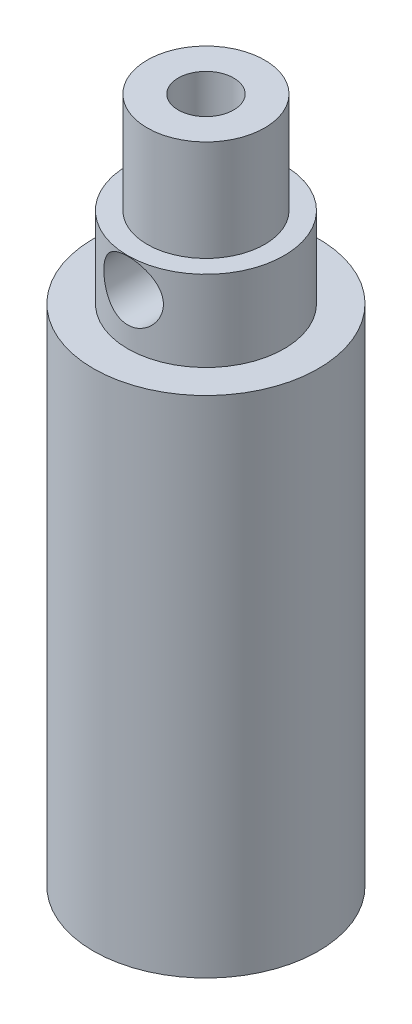
ISO-10303-21;
HEADER;
FILE_DESCRIPTION(('STEP AP214'),'2;1');
FILE_NAME('part.step','',(''),(''),'','','');
FILE_SCHEMA(('AUTOMOTIVE_DESIGN { 1 0 10303 214 1 1 1 1 }'));
ENDSEC;
DATA;
#1=APPLICATION_CONTEXT('core data for automotive mechanical design processes');
#2=APPLICATION_PROTOCOL_DEFINITION('international standard','automotive_design',2000,#1);
#3=PRODUCT_CONTEXT('',#1,'mechanical');
#4=PRODUCT('Part','Part','',(#3));
#5=PRODUCT_RELATED_PRODUCT_CATEGORY('part','',(#4));
#6=PRODUCT_DEFINITION_FORMATION('','',#4);
#7=PRODUCT_DEFINITION_CONTEXT('part definition',#1,'design');
#8=PRODUCT_DEFINITION('design','',#6,#7);
#9=PRODUCT_DEFINITION_SHAPE('','',#8);
#10=(LENGTH_UNIT() NAMED_UNIT(*) SI_UNIT(.MILLI.,.METRE.));
#11=(NAMED_UNIT(*) PLANE_ANGLE_UNIT() SI_UNIT($,.RADIAN.));
#12=(NAMED_UNIT(*) SI_UNIT($,.STERADIAN.) SOLID_ANGLE_UNIT());
#13=UNCERTAINTY_MEASURE_WITH_UNIT(LENGTH_MEASURE(1.E-05),#10,'distance_accuracy_value','');
#14=(GEOMETRIC_REPRESENTATION_CONTEXT(3) GLOBAL_UNCERTAINTY_ASSIGNED_CONTEXT((#13)) GLOBAL_UNIT_ASSIGNED_CONTEXT((#10,
#11,#12)) REPRESENTATION_CONTEXT('',''));
#15=CARTESIAN_POINT('',(0.,0.,0.));
#16=DIRECTION('',(0.,0.,1.));
#17=DIRECTION('',(1.,0.,0.));
#18=AXIS2_PLACEMENT_3D('',#15,#16,#17);
#19=CARTESIAN_POINT('',(0.,0.,0.));
#20=DIRECTION('',(0.,1.,0.));
#21=DIRECTION('',(0.,0.,1.));
#22=AXIS2_PLACEMENT_3D('',#19,#20,#21);
#23=CYLINDRICAL_SURFACE('',#22,2.75);
#24=CARTESIAN_POINT('',(0.,35.,0.));
#25=DIRECTION('',(0.,1.,0.));
#26=DIRECTION('',(0.,0.,1.));
#27=AXIS2_PLACEMENT_3D('',#24,#25,#26);
#28=CIRCLE('',#27,2.75);
#29=CARTESIAN_POINT('',(0.,35.,2.75));
#30=VERTEX_POINT('',#29);
#31=EDGE_CURVE('E144',#30,#30,#28,.T.);
#32=ORIENTED_EDGE('',*,*,#31,.F.);
#33=EDGE_LOOP('',(#32));
#34=FACE_BOUND('',#33,.T.);
#35=CARTESIAN_POINT('',(0.,68.,0.));
#36=DIRECTION('',(0.,1.,0.));
#37=DIRECTION('',(0.,0.,1.));
#38=AXIS2_PLACEMENT_3D('',#35,#36,#37);
#39=CIRCLE('',#38,2.75);
#40=CARTESIAN_POINT('',(0.,68.,2.75));
#41=VERTEX_POINT('',#40);
#42=EDGE_CURVE('E112',#41,#41,#39,.T.);
#43=ORIENTED_EDGE('',*,*,#42,.T.);
#44=EDGE_LOOP('',(#43));
#45=FACE_BOUND('',#44,.T.);
#46=DIRECTION('',(0.,1.,0.));
#47=VECTOR('',#46,1.);
#48=CARTESIAN_POINT('',(2.47785123976966,0.,1.1927922004993));
#49=LINE('',#48,#47);
#50=CARTESIAN_POINT('',(2.47785123976966,56.6008601542833,1.1927922004993));
#51=VERTEX_POINT('',#50);
#52=CARTESIAN_POINT('',(2.47785123976966,53.3991398457167,1.1927922004993));
#53=VERTEX_POINT('',#52);
#54=EDGE_CURVE('E12',#51,#53,#49,.F.);
#55=ORIENTED_EDGE('',*,*,#54,.F.);
#56=CARTESIAN_POINT('',(2.47785123976966,56.6008601542833,1.1927922004993));
#57=CARTESIAN_POINT('',(2.45691590086338,56.6332698766965,1.23626974499691));
#58=CARTESIAN_POINT('',(2.43492000277298,56.6659151317765,1.27904768779553));
#59=CARTESIAN_POINT('',(2.38878723279597,56.7314144832793,1.36327108741837));
#60=CARTESIAN_POINT('',(2.36465030139766,56.7642685854837,1.40471650716041));
#61=CARTESIAN_POINT('',(2.28889609665299,56.862883337748,1.52731866762622));
#62=CARTESIAN_POINT('',(2.23402150569533,56.9285607110212,1.60656267759827));
#63=CARTESIAN_POINT('',(2.11471529700325,57.0587302746027,1.76070466170261));
#64=CARTESIAN_POINT('',(2.05018119807848,57.1232002038607,1.83554230088267));
#65=CARTESIAN_POINT('',(1.91183806923222,57.2485732728751,1.97921894225549));
#66=CARTESIAN_POINT('',(1.83803945274993,57.3094803064205,2.04806453472508));
#67=CARTESIAN_POINT('',(1.66035590525942,57.441507112717,2.19598322277191));
#68=CARTESIAN_POINT('',(1.55364402224241,57.5111476122604,2.27304092924748));
#69=CARTESIAN_POINT('',(1.325576185214,57.638618556714,2.41311865633127));
#70=CARTESIAN_POINT('',(1.20428556415607,57.6964987783296,2.4761979495782));
#71=CARTESIAN_POINT('',(0.969492333384041,57.7885000079789,2.57605154297455));
#72=CARTESIAN_POINT('',(0.858041808235639,57.824970462666,2.61545468937514));
#73=CARTESIAN_POINT('',(0.627656214154241,57.8849070662636,2.68008129760087));
#74=CARTESIAN_POINT('',(0.508721290025062,57.9083734666829,2.70530503366729));
#75=CARTESIAN_POINT('',(0.265971255416853,57.9405453792016,2.7398627021727));
#76=CARTESIAN_POINT('',(0.142135767246276,57.9491807254557,2.74912110330246));
#77=CARTESIAN_POINT('',(-0.105726407274162,57.9507069313105,2.75075838286497));
#78=CARTESIAN_POINT('',(-0.22975304036205,57.9436015842491,2.74314132810105));
#79=CARTESIAN_POINT('',(-0.463869389757413,57.9154924981933,2.71295470049847));
#80=CARTESIAN_POINT('',(-0.574271934458768,57.8956667854339,2.69165232141047));
#81=CARTESIAN_POINT('',(-0.789153088246138,57.8446356645568,2.63667501622997));
#82=CARTESIAN_POINT('',(-0.89363012192504,57.8134272463718,2.6029968174312));
#83=CARTESIAN_POINT('',(-1.12685191523176,57.729928244538,2.51254970744046));
#84=CARTESIAN_POINT('',(-1.25280115757686,57.6740910406292,2.45184576238044));
#85=CARTESIAN_POINT('',(-1.48963550997847,57.5498003786474,2.31565268992034));
#86=CARTESIAN_POINT('',(-1.60048548884415,57.4813183428441,2.24013004705675));
#87=CARTESIAN_POINT('',(-1.84170194635459,57.3106702783203,2.0497818062155));
#88=CARTESIAN_POINT('',(-1.96591948066676,57.2049613767916,1.93031722697554));
#89=CARTESIAN_POINT('',(-2.13184280399656,57.040548126634,1.73921379222929));
#90=CARTESIAN_POINT('',(-2.18376218392696,56.9847516867598,1.67350742417047));
#91=CARTESIAN_POINT('',(-2.28105113522916,56.8721177755293,1.53825876150248));
#92=CARTESIAN_POINT('',(-2.32642418538799,56.8152808753156,1.46871853160547));
#93=CARTESIAN_POINT('',(-2.38819570426837,56.7320817679832,1.36400579606804));
#94=CARTESIAN_POINT('',(-2.40711819654542,56.7056689766892,1.3303312236134));
#95=CARTESIAN_POINT('',(-2.44353699137948,56.6530724913947,1.26218575222079));
#96=CARTESIAN_POINT('',(-2.46103636671074,56.6268884189801,1.22771678701234));
#97=CARTESIAN_POINT('',(-2.47785123976966,56.6008601542833,1.1927922004993));
#98=B_SPLINE_CURVE_WITH_KNOTS('',3,(#56,#57,#58,#59,#60,#61,#62,#63,#64,#65,#66,#67,#68,#69,#70,
#71,#72,#73,#74,#75,#76,#77,#78,#79,#80,#81,#82,#83,#84,#85,#86,#87,#88,#89,#90,#91,#92,#93,#94,
#95,#96,#97),.UNSPECIFIED.,.F.,.F.,(4,2,2,2,2,2,2,2,2,2,2,2,2,2,2,2,2,2,2,2,4),(0.,
0.174353919779955,0.348712687384918,0.698148696355609,1.05159616615623,1.40464985496544,
1.84978099103621,2.2929868996592,2.66258502259707,3.03217599696174,3.40351074158639,
3.77475600826656,4.11579134524117,4.45691693180207,4.9060946982763,5.3563003304899,
5.95933623611324,6.26102932442716,6.56256149471044,6.702920826426,6.84296857185743),.UNSPECIFIED.);
#99=CARTESIAN_POINT('',(-2.47785123976966,56.6008601542833,1.1927922004993));
#100=VERTEX_POINT('',#99);
#101=EDGE_CURVE('E53',#51,#100,#98,.T.);
#102=ORIENTED_EDGE('',*,*,#101,.T.);
#103=DIRECTION('',(0.,1.,0.));
#104=VECTOR('',#103,1.);
#105=CARTESIAN_POINT('',(-2.47785123976966,0.,1.1927922004993));
#106=LINE('',#105,#104);
#107=CARTESIAN_POINT('',(-2.47785123976966,53.3991398457167,1.1927922004993));
#108=VERTEX_POINT('',#107);
#109=EDGE_CURVE('E81',#108,#100,#106,.T.);
#110=ORIENTED_EDGE('',*,*,#109,.F.);
#111=CARTESIAN_POINT('',(-2.47785123976966,53.3991398457167,1.1927922004993));
#112=CARTESIAN_POINT('',(-2.45691590086338,53.3667301233036,1.23626974499691));
#113=CARTESIAN_POINT('',(-2.43492000277297,53.3340848682235,1.27904768779553));
#114=CARTESIAN_POINT('',(-2.38878723279597,53.2685855167207,1.36327108741837));
#115=CARTESIAN_POINT('',(-2.36465030139765,53.2357314145163,1.40471650716042));
#116=CARTESIAN_POINT('',(-2.28889609665299,53.137116662252,1.52731866762622));
#117=CARTESIAN_POINT('',(-2.23402150569533,53.0714392889788,1.60656267759827));
#118=CARTESIAN_POINT('',(-2.11471529700325,52.9412697253973,1.76070466170261));
#119=CARTESIAN_POINT('',(-2.05018119807848,52.8767997961393,1.83554230088267));
#120=CARTESIAN_POINT('',(-1.91183806923222,52.7514267271249,1.9792189422555));
#121=CARTESIAN_POINT('',(-1.83803945274993,52.6905196935795,2.04806453472508));
#122=CARTESIAN_POINT('',(-1.66035590525942,52.558492887283,2.19598322277191));
#123=CARTESIAN_POINT('',(-1.55364402224241,52.4888523877396,2.27304092924748));
#124=CARTESIAN_POINT('',(-1.325576185214,52.3613814432861,2.41311865633127));
#125=CARTESIAN_POINT('',(-1.20428556415607,52.3035012216704,2.4761979495782));
#126=CARTESIAN_POINT('',(-0.96949233338404,52.2114999920211,2.57605154297455));
#127=CARTESIAN_POINT('',(-0.858041808235638,52.175029537334,2.61545468937514));
#128=CARTESIAN_POINT('',(-0.627656214154241,52.1150929337364,2.68008129760087));
#129=CARTESIAN_POINT('',(-0.508721290025061,52.0916265333171,2.70530503366729));
#130=CARTESIAN_POINT('',(-0.265971255416851,52.0594546207984,2.7398627021727));
#131=CARTESIAN_POINT('',(-0.142135767246275,52.0508192745443,2.74912110330246));
#132=CARTESIAN_POINT('',(0.105726407274164,52.0492930686895,2.75075838286497));
#133=CARTESIAN_POINT('',(0.229753040362051,52.056398415751,2.74314132810105));
#134=CARTESIAN_POINT('',(0.463869389757415,52.0845075018067,2.71295470049847));
#135=CARTESIAN_POINT('',(0.574271934458772,52.1043332145661,2.69165232141047));
#136=CARTESIAN_POINT('',(0.789153088246142,52.1553643354433,2.63667501622997));
#137=CARTESIAN_POINT('',(0.893630121925043,52.1865727536282,2.6029968174312));
#138=CARTESIAN_POINT('',(1.12685191523176,52.270071755462,2.51254970744046));
#139=CARTESIAN_POINT('',(1.25280115757686,52.3259089593708,2.45184576238044));
#140=CARTESIAN_POINT('',(1.48963550997847,52.4501996213526,2.31565268992034));
#141=CARTESIAN_POINT('',(1.60048548884415,52.518681657156,2.24013004705675));
#142=CARTESIAN_POINT('',(1.8417019463546,52.6893297216797,2.0497818062155));
#143=CARTESIAN_POINT('',(1.96591948066676,52.7950386232084,1.93031722697554));
#144=CARTESIAN_POINT('',(2.13184280399656,52.9594518733661,1.73921379222929));
#145=CARTESIAN_POINT('',(2.18376218392696,53.0152483132402,1.67350742417047));
#146=CARTESIAN_POINT('',(2.28105113522916,53.1278822244707,1.53825876150249));
#147=CARTESIAN_POINT('',(2.32642418538799,53.1847191246844,1.46871853160547));
#148=CARTESIAN_POINT('',(2.38819570426837,53.2679182320168,1.36400579606804));
#149=CARTESIAN_POINT('',(2.40711819654543,53.2943310233108,1.33033122361339));
#150=CARTESIAN_POINT('',(2.44353699137948,53.3469275086053,1.26218575222079));
#151=CARTESIAN_POINT('',(2.46103636671074,53.3731115810199,1.22771678701234));
#152=CARTESIAN_POINT('',(2.47785123976966,53.3991398457167,1.1927922004993));
#153=B_SPLINE_CURVE_WITH_KNOTS('',3,(#111,#112,#113,#114,#115,#116,#117,#118,#119,#120,#121,
#122,#123,#124,#125,#126,#127,#128,#129,#130,#131,#132,#133,#134,#135,#136,#137,#138,#139,#140,
#141,#142,#143,#144,#145,#146,#147,#148,#149,#150,#151,#152),.UNSPECIFIED.,.F.,.F.,(4,2,2,2,2,2,
2,2,2,2,2,2,2,2,2,2,2,2,2,2,4),(0.,0.174353919779958,0.34871268738492,0.698148696355608,
1.05159616615623,1.40464985496544,1.84978099103622,2.2929868996592,2.66258502259707,
3.03217599696174,3.40351074158639,3.77475600826656,4.11579134524118,4.45691693180207,
4.9060946982763,5.3563003304899,5.95933623611324,6.26102932442716,6.56256149471044,
6.70292082642601,6.84296857185743),.UNSPECIFIED.);
#154=EDGE_CURVE('E78',#108,#53,#153,.T.);
#155=ORIENTED_EDGE('',*,*,#154,.T.);
#156=EDGE_LOOP('',(#55,#102,#110,#155));
#157=FACE_BOUND('',#156,.T.);
#158=ADVANCED_FACE('F45',(#34,#45,#157),#23,.F.);
#159=CARTESIAN_POINT('',(0.,50.,0.));
#160=DIRECTION('',(0.,-1.,0.));
#161=DIRECTION('',(0.,0.,-1.));
#162=AXIS2_PLACEMENT_3D('',#159,#160,#161);
#163=CYLINDRICAL_SURFACE('',#162,11.15);
#164=CARTESIAN_POINT('',(0.,50.,0.));
#165=DIRECTION('',(0.,1.,0.));
#166=DIRECTION('',(0.,0.,1.));
#167=AXIS2_PLACEMENT_3D('',#164,#165,#166);
#168=CIRCLE('',#167,11.15);
#169=CARTESIAN_POINT('',(0.,50.,11.15));
#170=VERTEX_POINT('',#169);
#171=EDGE_CURVE('E156',#170,#170,#168,.T.);
#172=ORIENTED_EDGE('',*,*,#171,.F.);
#173=EDGE_LOOP('',(#172));
#174=FACE_BOUND('',#173,.T.);
#175=CARTESIAN_POINT('',(0.,0.,0.));
#176=DIRECTION('',(0.,1.,0.));
#177=DIRECTION('',(0.,0.,1.));
#178=AXIS2_PLACEMENT_3D('',#175,#176,#177);
#179=CIRCLE('',#178,11.15);
#180=CARTESIAN_POINT('',(0.,0.,11.15));
#181=VERTEX_POINT('',#180);
#182=EDGE_CURVE('E153',#181,#181,#179,.T.);
#183=ORIENTED_EDGE('',*,*,#182,.T.);
#184=EDGE_LOOP('',(#183));
#185=FACE_BOUND('',#184,.T.);
#186=ADVANCED_FACE('F47',(#174,#185),#163,.T.);
#187=CARTESIAN_POINT('',(0.,50.,0.));
#188=DIRECTION('',(0.,1.,0.));
#189=DIRECTION('',(0.,0.,1.));
#190=AXIS2_PLACEMENT_3D('',#187,#188,#189);
#191=PLANE('',#190);
#192=CARTESIAN_POINT('',(0.,50.,0.));
#193=DIRECTION('',(0.,1.,0.));
#194=DIRECTION('',(0.,0.,1.));
#195=AXIS2_PLACEMENT_3D('',#192,#193,#194);
#196=CIRCLE('',#195,7.75);
#197=CARTESIAN_POINT('',(0.,50.,7.75));
#198=VERTEX_POINT('',#197);
#199=EDGE_CURVE('E160',#198,#198,#196,.T.);
#200=ORIENTED_EDGE('',*,*,#199,.F.);
#201=EDGE_LOOP('',(#200));
#202=FACE_BOUND('',#201,.T.);
#203=ORIENTED_EDGE('',*,*,#171,.T.);
#204=EDGE_LOOP('',(#203));
#205=FACE_BOUND('',#204,.T.);
#206=ADVANCED_FACE('F123',(#202,#205),#191,.T.);
#207=CARTESIAN_POINT('',(0.,0.,0.));
#208=DIRECTION('',(0.,1.,0.));
#209=DIRECTION('',(0.,0.,1.));
#210=AXIS2_PLACEMENT_3D('',#207,#208,#209);
#211=PLANE('',#210);
#212=CARTESIAN_POINT('',(0.,0.,0.));
#213=DIRECTION('',(0.,-1.,0.));
#214=DIRECTION('',(0.,0.,-1.));
#215=AXIS2_PLACEMENT_3D('',#212,#213,#214);
#216=CIRCLE('',#215,9.1);
#217=CARTESIAN_POINT('',(0.,0.,-9.1));
#218=VERTEX_POINT('',#217);
#219=EDGE_CURVE('E148',#218,#218,#216,.T.);
#220=ORIENTED_EDGE('',*,*,#219,.F.);
#221=EDGE_LOOP('',(#220));
#222=FACE_BOUND('',#221,.T.);
#223=ORIENTED_EDGE('',*,*,#182,.F.);
#224=EDGE_LOOP('',(#223));
#225=FACE_BOUND('',#224,.T.);
#226=ADVANCED_FACE('F120',(#222,#225),#211,.F.);
#227=CARTESIAN_POINT('',(0.,58.,0.));
#228=DIRECTION('',(0.,-1.,0.));
#229=DIRECTION('',(0.,0.,-1.));
#230=AXIS2_PLACEMENT_3D('',#227,#228,#229);
#231=CYLINDRICAL_SURFACE('',#230,7.75);
#232=CARTESIAN_POINT('',(2.95,55.,7.16658914686757));
#233=CARTESIAN_POINT('',(2.94998865866583,54.8409948195034,7.16659961457185));
#234=CARTESIAN_POINT('',(2.93707897730719,54.6818423559038,7.17195027676966));
#235=CARTESIAN_POINT('',(2.88598302030448,54.3684477059428,7.19265723532857));
#236=CARTESIAN_POINT('',(2.847798089523,54.2142052587835,7.20801299933077));
#237=CARTESIAN_POINT('',(2.74778636632212,53.9151171211151,7.24672444996012));
#238=CARTESIAN_POINT('',(2.6860177699288,53.7702493183433,7.27006042960501));
#239=CARTESIAN_POINT('',(2.54079343858982,53.4928830185756,7.32207596587927));
#240=CARTESIAN_POINT('',(2.4573309842523,53.3603883713184,7.35075717734474));
#241=CARTESIAN_POINT('',(2.26650919340754,53.1047302468616,7.4118764900262));
#242=CARTESIAN_POINT('',(2.15821743051809,52.9822894236851,7.44442738440248));
#243=CARTESIAN_POINT('',(1.92278736870598,52.7567952014205,7.50867931031878));
#244=CARTESIAN_POINT('',(1.7956449022786,52.6537461009062,7.54038015209485));
#245=CARTESIAN_POINT('',(1.52060740550182,52.4664483038574,7.60070607373645));
#246=CARTESIAN_POINT('',(1.37213929386288,52.3829893409258,7.62918355165808));
#247=CARTESIAN_POINT('',(1.0619938848085,52.2425343414784,7.67849412038476));
#248=CARTESIAN_POINT('',(0.900321343029722,52.1855288266238,7.69932994865072));
#249=CARTESIAN_POINT('',(0.575957656989306,52.1021460843827,7.73020844490016));
#250=CARTESIAN_POINT('',(0.413629060097805,52.0745236590281,7.7406884428877));
#251=CARTESIAN_POINT('',(0.0863246789741779,52.0466970227121,7.75124643567573));
#252=CARTESIAN_POINT('',(-0.078650199815708,52.0464836256015,7.7513279155446));
#253=CARTESIAN_POINT('',(-0.397622394883306,52.0727653702648,7.74135519764024));
#254=CARTESIAN_POINT('',(-0.551750759182599,52.0979002655375,7.73181720128206));
#255=CARTESIAN_POINT('',(-0.85341198876398,52.1718713225362,7.70435841497361));
#256=CARTESIAN_POINT('',(-1.00094438469224,52.220709167987,7.6864370295176));
#257=CARTESIAN_POINT('',(-1.28780328759038,52.3413096338999,7.64365231004129));
#258=CARTESIAN_POINT('',(-1.42697737562484,52.4133985445684,7.61869084697264));
#259=CARTESIAN_POINT('',(-1.69160226459349,52.5781624731188,7.56434116402282));
#260=CARTESIAN_POINT('',(-1.81704854756465,52.6708442380929,7.53495149429155));
#261=CARTESIAN_POINT('',(-2.0586541808929,52.8806711812751,7.47267931034266));
#262=CARTESIAN_POINT('',(-2.17380205030234,52.998951965117,7.43969303231914));
#263=CARTESIAN_POINT('',(-2.38301642959986,53.253328015287,7.37534680425408));
#264=CARTESIAN_POINT('',(-2.4770773093192,53.3894280239717,7.34398729026782));
#265=CARTESIAN_POINT('',(-2.64346222795297,53.679686588324,7.28577963612884));
#266=CARTESIAN_POINT('',(-2.7152242086891,53.8341940452033,7.25905467077139));
#267=CARTESIAN_POINT('',(-2.83132365974512,54.1543868572594,7.21456984720107));
#268=CARTESIAN_POINT('',(-2.87567694880983,54.3200657035844,7.1968048189104));
#269=CARTESIAN_POINT('',(-2.9333639759074,54.6478796156304,7.17347861436356));
#270=CARTESIAN_POINT('',(-2.94830942981538,54.809685609154,7.16728435721403));
#271=CARTESIAN_POINT('',(-2.95141775355474,55.1335766601199,7.166006233469));
#272=CARTESIAN_POINT('',(-2.93958761316205,55.2956616336968,7.17091946725967));
#273=CARTESIAN_POINT('',(-2.89094334864833,55.6070953807451,7.19065823635581));
#274=CARTESIAN_POINT('',(-2.85539489277321,55.7566774506741,7.20498108432288));
#275=CARTESIAN_POINT('',(-2.76192641295152,56.0476787650716,7.24132298865376));
#276=CARTESIAN_POINT('',(-2.70400172164676,56.189096299458,7.26334365057875));
#277=CARTESIAN_POINT('',(-2.5649387586666,56.4657672272932,7.31363382023783));
#278=CARTESIAN_POINT('',(-2.48299806738495,56.6005786196518,7.34210994586741));
#279=CARTESIAN_POINT('',(-2.29907525984968,56.8551086789892,7.40176249942683));
#280=CARTESIAN_POINT('',(-2.19708561837067,56.9748216511057,7.43293993880996));
#281=CARTESIAN_POINT('',(-1.96803871575943,57.2039154699733,7.49695600968506));
#282=CARTESIAN_POINT('',(-1.83977509700773,57.312101532753,7.5297692769403));
#283=CARTESIAN_POINT('',(-1.5661127510559,57.5055667794596,7.59140554401753));
#284=CARTESIAN_POINT('',(-1.42071384014262,57.5908457177594,7.62022850105089));
#285=CARTESIAN_POINT('',(-1.11687903714305,57.7355623306532,7.6706387975175));
#286=CARTESIAN_POINT('',(-0.958481193978615,57.7950724343335,7.69224637769313));
#287=CARTESIAN_POINT('',(-0.6329094401338,57.8862545128972,7.72584286550078));
#288=CARTESIAN_POINT('',(-0.465739836862944,57.9179400180737,7.73783644789268));
#289=CARTESIAN_POINT('',(-0.138152667403949,57.9510816562428,7.75039822169678));
#290=CARTESIAN_POINT('',(0.0220702639674789,57.9542333972392,7.75160721547871));
#291=CARTESIAN_POINT('',(0.340668610032347,57.9346052413507,7.74414770360241));
#292=CARTESIAN_POINT('',(0.499044256541421,57.9118286343639,7.73548045108384));
#293=CARTESIAN_POINT('',(0.805302514211144,57.8421869538426,7.70954120088729));
#294=CARTESIAN_POINT('',(0.953350287215577,57.7959570352139,7.69249644155938));
#295=CARTESIAN_POINT('',(1.23959174775678,57.6813603041514,7.6515905381698));
#296=CARTESIAN_POINT('',(1.37778356281402,57.6129892988518,7.62772810314318));
#297=CARTESIAN_POINT('',(1.64684167138755,57.452747099893,7.57430057445326));
#298=CARTESIAN_POINT('',(1.77714523020146,57.3599989839134,7.54453587470056));
#299=CARTESIAN_POINT('',(2.02085884092083,57.1549943808291,7.4829444562399));
#300=CARTESIAN_POINT('',(2.13426276505881,57.0427308492927,7.45111699555301));
#301=CARTESIAN_POINT('',(2.34735102621369,56.7946139064405,7.38684695548433));
#302=CARTESIAN_POINT('',(2.44594381918208,56.6578052668254,7.35446615381571));
#303=CARTESIAN_POINT('',(2.61882677858092,56.3684298156329,7.29470101785897));
#304=CARTESIAN_POINT('',(2.69311297869883,56.2158604375812,7.26731749934194));
#305=CARTESIAN_POINT('',(2.7860474187925,55.9739157583894,7.23198490629082));
#306=CARTESIAN_POINT('',(2.81442401232459,55.888607585256,7.22095584260402));
#307=CARTESIAN_POINT('',(2.86333202022289,55.715476716251,7.2017029426031));
#308=CARTESIAN_POINT('',(2.88386700812949,55.6276551854163,7.19347782866967));
#309=CARTESIAN_POINT('',(2.91682438897929,55.4502962594891,7.180177910666));
#310=CARTESIAN_POINT('',(2.92924964998094,55.3607594825486,7.17510199289316));
#311=CARTESIAN_POINT('',(2.94584012036048,55.1808309412681,7.16830486171353));
#312=CARTESIAN_POINT('',(2.95000645074745,55.0904392946359,7.16658319302513));
#313=CARTESIAN_POINT('',(2.95,55.,7.16658914686757));
#314=B_SPLINE_CURVE_WITH_KNOTS('',3,(#232,#233,#234,#235,#236,#237,#238,#239,#240,#241,#242,
#243,#244,#245,#246,#247,#248,#249,#250,#251,#252,#253,#254,#255,#256,#257,#258,#259,#260,#261,
#262,#263,#264,#265,#266,#267,#268,#269,#270,#271,#272,#273,#274,#275,#276,#277,#278,#279,#280,
#281,#282,#283,#284,#285,#286,#287,#288,#289,#290,#291,#292,#293,#294,#295,#296,#297,#298,#299,
#300,#301,#302,#303,#304,#305,#306,#307,#308,#309,#310,#311,#312,#313),.UNSPECIFIED.,.T.,.F.,(4,
2,2,2,2,2,2,2,2,2,2,2,2,2,2,2,2,2,2,2,2,2,2,2,2,2,2,2,2,2,2,2,2,2,2,2,2,2,2,2,4),(0.,
0.476673970950883,0.953322580748914,1.42880251612635,1.90442990112557,2.40222374729265,
2.90012781004585,3.4155633970953,3.93081415937344,4.42323452670125,4.9154898586714,
5.38266477404106,5.84987287975773,6.32394567001607,6.79817401627103,7.30090782753367,
7.80377570791233,8.31844747311426,8.83282192081794,9.31812040609934,9.80329221869572,
10.2644485042275,10.7257010322565,11.2045779945129,11.683635044085,12.1941518666764,
12.7046741631856,13.2137520580535,13.7225822658483,14.2009613286324,14.6792796994279,
15.1452856405035,15.6113798809539,16.0973268686629,16.5834496330895,17.0961961978996,
17.6090263902292,17.8804066066901,18.1516630029985,18.4228234156361,18.693947020348),.UNSPECIFIED.);
#315=CARTESIAN_POINT('',(2.95,55.,7.16658914686757));
#316=VERTEX_POINT('',#315);
#317=EDGE_CURVE('E105',#316,#316,#314,.T.);
#318=ORIENTED_EDGE('',*,*,#317,.T.);
#319=EDGE_LOOP('',(#318));
#320=FACE_BOUND('',#319,.T.);
#321=CARTESIAN_POINT('',(0.,58.,0.));
#322=DIRECTION('',(0.,1.,0.));
#323=DIRECTION('',(0.,0.,1.));
#324=AXIS2_PLACEMENT_3D('',#321,#322,#323);
#325=CIRCLE('',#324,7.75);
#326=CARTESIAN_POINT('',(0.,58.,7.75));
#327=VERTEX_POINT('',#326);
#328=EDGE_CURVE('E157',#327,#327,#325,.T.);
#329=ORIENTED_EDGE('',*,*,#328,.F.);
#330=EDGE_LOOP('',(#329));
#331=FACE_BOUND('',#330,.T.);
#332=ORIENTED_EDGE('',*,*,#199,.T.);
#333=EDGE_LOOP('',(#332));
#334=FACE_BOUND('',#333,.T.);
#335=ADVANCED_FACE('F114',(#320,#331,#334),#231,.T.);
#336=CARTESIAN_POINT('',(0.,58.,0.));
#337=DIRECTION('',(0.,1.,0.));
#338=DIRECTION('',(0.,0.,1.));
#339=AXIS2_PLACEMENT_3D('',#336,#337,#338);
#340=PLANE('',#339);
#341=CARTESIAN_POINT('',(0.,58.,0.));
#342=DIRECTION('',(0.,1.,0.));
#343=DIRECTION('',(0.,0.,1.));
#344=AXIS2_PLACEMENT_3D('',#341,#342,#343);
#345=CIRCLE('',#344,5.825);
#346=CARTESIAN_POINT('',(0.,58.,5.825));
#347=VERTEX_POINT('',#346);
#348=EDGE_CURVE('E83',#347,#347,#345,.T.);
#349=ORIENTED_EDGE('',*,*,#348,.F.);
#350=EDGE_LOOP('',(#349));
#351=FACE_BOUND('',#350,.T.);
#352=ORIENTED_EDGE('',*,*,#328,.T.);
#353=EDGE_LOOP('',(#352));
#354=FACE_BOUND('',#353,.T.);
#355=ADVANCED_FACE('F119',(#351,#354),#340,.T.);
#356=CARTESIAN_POINT('',(0.,68.,0.));
#357=DIRECTION('',(0.,-1.,0.));
#358=DIRECTION('',(0.,0.,-1.));
#359=AXIS2_PLACEMENT_3D('',#356,#357,#358);
#360=CYLINDRICAL_SURFACE('',#359,5.825);
#361=CARTESIAN_POINT('',(0.,68.,0.));
#362=DIRECTION('',(0.,1.,0.));
#363=DIRECTION('',(0.,0.,1.));
#364=AXIS2_PLACEMENT_3D('',#361,#362,#363);
#365=CIRCLE('',#364,5.825);
#366=CARTESIAN_POINT('',(0.,68.,5.825));
#367=VERTEX_POINT('',#366);
#368=EDGE_CURVE('E165',#367,#367,#365,.T.);
#369=ORIENTED_EDGE('',*,*,#368,.F.);
#370=EDGE_LOOP('',(#369));
#371=FACE_BOUND('',#370,.T.);
#372=ORIENTED_EDGE('',*,*,#348,.T.);
#373=EDGE_LOOP('',(#372));
#374=FACE_BOUND('',#373,.T.);
#375=ADVANCED_FACE('F182',(#371,#374),#360,.T.);
#376=CARTESIAN_POINT('',(0.,68.,0.));
#377=DIRECTION('',(0.,1.,0.));
#378=DIRECTION('',(0.,0.,1.));
#379=AXIS2_PLACEMENT_3D('',#376,#377,#378);
#380=PLANE('',#379);
#381=ORIENTED_EDGE('',*,*,#42,.F.);
#382=EDGE_LOOP('',(#381));
#383=FACE_BOUND('',#382,.T.);
#384=ORIENTED_EDGE('',*,*,#368,.T.);
#385=EDGE_LOOP('',(#384));
#386=FACE_BOUND('',#385,.T.);
#387=ADVANCED_FACE('F179',(#383,#386),#380,.T.);
#388=CARTESIAN_POINT('',(0.,35.,0.));
#389=DIRECTION('',(0.,1.,0.));
#390=DIRECTION('',(0.,0.,1.));
#391=AXIS2_PLACEMENT_3D('',#388,#389,#390);
#392=PLANE('',#391);
#393=ORIENTED_EDGE('',*,*,#31,.T.);
#394=EDGE_LOOP('',(#393));
#395=FACE_BOUND('',#394,.T.);
#396=CARTESIAN_POINT('',(0.,35.,0.));
#397=DIRECTION('',(0.,1.,0.));
#398=DIRECTION('',(0.,0.,1.));
#399=AXIS2_PLACEMENT_3D('',#396,#397,#398);
#400=CIRCLE('',#399,9.1);
#401=CARTESIAN_POINT('',(0.,35.,-9.1));
#402=VERTEX_POINT('',#401);
#403=EDGE_CURVE('E151',#402,#402,#400,.F.);
#404=ORIENTED_EDGE('',*,*,#403,.T.);
#405=EDGE_LOOP('',(#404));
#406=FACE_BOUND('',#405,.T.);
#407=ADVANCED_FACE('F173',(#395,#406),#392,.F.);
#408=CARTESIAN_POINT('',(0.,75.7386868351903,0.));
#409=DIRECTION('',(0.,-1.,0.));
#410=DIRECTION('',(0.,0.,-1.));
#411=AXIS2_PLACEMENT_3D('',#408,#409,#410);
#412=CYLINDRICAL_SURFACE('',#411,9.1);
#413=CARTESIAN_POINT('',(0.,0.,-9.1));
#414=CARTESIAN_POINT('',(0.,0.364583333333349,-9.1));
#415=CARTESIAN_POINT('',(0.,0.729166666666684,-9.1));
#416=CARTESIAN_POINT('',(0.,1.45833333333335,-9.1));
#417=CARTESIAN_POINT('',(0.,1.82291666666668,-9.1));
#418=CARTESIAN_POINT('',(0.,2.55208333333334,-9.1));
#419=CARTESIAN_POINT('',(0.,2.91666666666668,-9.1));
#420=CARTESIAN_POINT('',(0.,3.64583333333335,-9.1));
#421=CARTESIAN_POINT('',(0.,4.01041666666668,-9.1));
#422=CARTESIAN_POINT('',(0.,4.73958333333335,-9.1));
#423=CARTESIAN_POINT('',(0.,5.10416666666668,-9.1));
#424=CARTESIAN_POINT('',(0.,5.83333333333334,-9.1));
#425=CARTESIAN_POINT('',(0.,6.19791666666668,-9.1));
#426=CARTESIAN_POINT('',(0.,6.92708333333335,-9.1));
#427=CARTESIAN_POINT('',(0.,7.29166666666668,-9.1));
#428=CARTESIAN_POINT('',(0.,8.02083333333335,-9.1));
#429=CARTESIAN_POINT('',(0.,8.38541666666668,-9.1));
#430=CARTESIAN_POINT('',(0.,9.11458333333334,-9.1));
#431=CARTESIAN_POINT('',(0.,9.47916666666668,-9.1));
#432=CARTESIAN_POINT('',(0.,10.2083333333333,-9.1));
#433=CARTESIAN_POINT('',(0.,10.5729166666667,-9.1));
#434=CARTESIAN_POINT('',(0.,11.3020833333333,-9.1));
#435=CARTESIAN_POINT('',(0.,11.6666666666667,-9.1));
#436=CARTESIAN_POINT('',(0.,12.3958333333333,-9.1));
#437=CARTESIAN_POINT('',(0.,12.7604166666667,-9.1));
#438=CARTESIAN_POINT('',(0.,13.4895833333333,-9.1));
#439=CARTESIAN_POINT('',(0.,13.8541666666667,-9.1));
#440=CARTESIAN_POINT('',(0.,14.5833333333333,-9.1));
#441=CARTESIAN_POINT('',(0.,14.9479166666667,-9.1));
#442=CARTESIAN_POINT('',(0.,15.6770833333333,-9.1));
#443=CARTESIAN_POINT('',(0.,16.0416666666667,-9.1));
#444=CARTESIAN_POINT('',(0.,16.7708333333333,-9.1));
#445=CARTESIAN_POINT('',(0.,17.1354166666667,-9.1));
#446=CARTESIAN_POINT('',(0.,17.8645833333333,-9.1));
#447=CARTESIAN_POINT('',(0.,18.2291666666667,-9.1));
#448=CARTESIAN_POINT('',(0.,18.9583333333333,-9.1));
#449=CARTESIAN_POINT('',(0.,19.3229166666667,-9.1));
#450=CARTESIAN_POINT('',(0.,20.0520833333333,-9.1));
#451=CARTESIAN_POINT('',(0.,20.4166666666667,-9.1));
#452=CARTESIAN_POINT('',(0.,21.1458333333333,-9.1));
#453=CARTESIAN_POINT('',(0.,21.5104166666667,-9.1));
#454=CARTESIAN_POINT('',(0.,22.2395833333333,-9.1));
#455=CARTESIAN_POINT('',(0.,22.6041666666667,-9.1));
#456=CARTESIAN_POINT('',(0.,23.3333333333333,-9.1));
#457=CARTESIAN_POINT('',(0.,23.6979166666667,-9.1));
#458=CARTESIAN_POINT('',(0.,24.4270833333333,-9.1));
#459=CARTESIAN_POINT('',(0.,24.7916666666667,-9.1));
#460=CARTESIAN_POINT('',(0.,25.5208333333333,-9.1));
#461=CARTESIAN_POINT('',(0.,25.8854166666667,-9.1));
#462=CARTESIAN_POINT('',(0.,26.6145833333333,-9.1));
#463=CARTESIAN_POINT('',(0.,26.9791666666667,-9.1));
#464=CARTESIAN_POINT('',(0.,27.7083333333333,-9.1));
#465=CARTESIAN_POINT('',(0.,28.0729166666667,-9.1));
#466=CARTESIAN_POINT('',(0.,28.8020833333333,-9.1));
#467=CARTESIAN_POINT('',(0.,29.1666666666667,-9.1));
#468=CARTESIAN_POINT('',(0.,29.8958333333333,-9.1));
#469=CARTESIAN_POINT('',(0.,30.2604166666667,-9.1));
#470=CARTESIAN_POINT('',(0.,30.9895833333333,-9.1));
#471=CARTESIAN_POINT('',(0.,31.3541666666667,-9.1));
#472=CARTESIAN_POINT('',(0.,32.0833333333333,-9.1));
#473=CARTESIAN_POINT('',(0.,32.4479166666667,-9.1));
#474=CARTESIAN_POINT('',(0.,33.1770833333333,-9.1));
#475=CARTESIAN_POINT('',(0.,33.5416666666667,-9.1));
#476=CARTESIAN_POINT('',(0.,34.2708333333333,-9.1));
#477=CARTESIAN_POINT('',(0.,34.6354166666667,-9.1));
#478=CARTESIAN_POINT('',(0.,35.,-9.1));
#479=B_SPLINE_CURVE_WITH_KNOTS('',3,(#413,#414,#415,#416,#417,#418,#419,#420,#421,#422,#423,
#424,#425,#426,#427,#428,#429,#430,#431,#432,#433,#434,#435,#436,#437,#438,#439,#440,#441,#442,
#443,#444,#445,#446,#447,#448,#449,#450,#451,#452,#453,#454,#455,#456,#457,#458,#459,#460,#461,
#462,#463,#464,#465,#466,#467,#468,#469,#470,#471,#472,#473,#474,#475,#476,#477,#478),
.UNSPECIFIED.,.F.,.F.,(4,2,2,2,2,2,2,2,2,2,2,2,2,2,2,2,2,2,2,2,2,2,2,2,2,2,2,2,2,2,2,2,4),(0.,
1.09375,2.1875,3.28125,4.375,5.46874999999999,6.5625,7.65625,8.74999999999999,9.84375,10.9375,
12.03125,13.125,14.21875,15.3125,16.40625,17.5,18.59375,19.6875,20.78125,21.875,22.96875,
24.0625,25.15625,26.25,27.34375,28.4375,29.53125,30.625,31.71875,32.8125,33.90625,35.),.UNSPECIFIED.);
#480=EDGE_CURVE('BSEAM101',#218,#402,#479,.T.);
#481=ORIENTED_EDGE('',*,*,#219,.T.);
#482=ORIENTED_EDGE('',*,*,#403,.F.);
#483=ORIENTED_EDGE('',*,*,#480,.T.);
#484=ORIENTED_EDGE('',*,*,#480,.F.);
#485=EDGE_LOOP('',(#481,#483,#482,#484));
#486=FACE_BOUND('',#485,.T.);
#487=ADVANCED_FACE('F101',(#486),#412,.F.);
#488=CARTESIAN_POINT('',(0.,55.,1.1927922004993));
#489=DIRECTION('',(0.,0.,1.));
#490=DIRECTION('',(1.,0.,0.));
#491=AXIS2_PLACEMENT_3D('',#488,#489,#490);
#492=CYLINDRICAL_SURFACE('',#491,2.95);
#493=CARTESIAN_POINT('',(0.,55.,1.1927922004993));
#494=DIRECTION('',(0.,0.,1.));
#495=DIRECTION('',(1.,0.,0.));
#496=AXIS2_PLACEMENT_3D('',#493,#494,#495);
#497=CIRCLE('',#496,2.95);
#498=EDGE_CURVE('E74',#53,#51,#497,.T.);
#499=ORIENTED_EDGE('',*,*,#498,.F.);
#500=ORIENTED_EDGE('',*,*,#154,.F.);
#501=EDGE_CURVE('E59',#100,#108,#497,.T.);
#502=ORIENTED_EDGE('',*,*,#501,.F.);
#503=ORIENTED_EDGE('',*,*,#101,.F.);
#504=EDGE_LOOP('',(#499,#500,#502,#503));
#505=FACE_BOUND('',#504,.T.);
#506=ORIENTED_EDGE('',*,*,#317,.F.);
#507=EDGE_LOOP('',(#506));
#508=FACE_BOUND('',#507,.T.);
#509=ADVANCED_FACE('F72',(#505,#508),#492,.F.);
#510=CARTESIAN_POINT('',(0.,0.,1.1927922004993));
#511=DIRECTION('',(0.,0.,1.));
#512=DIRECTION('',(1.,0.,0.));
#513=AXIS2_PLACEMENT_3D('',#510,#511,#512);
#514=PLANE('',#513);
#515=ORIENTED_EDGE('',*,*,#54,.T.);
#516=ORIENTED_EDGE('',*,*,#498,.T.);
#517=EDGE_LOOP('',(#515,#516));
#518=FACE_BOUND('',#517,.T.);
#519=ADVANCED_FACE('F79',(#518),#514,.T.);
#520=ORIENTED_EDGE('',*,*,#109,.T.);
#521=ORIENTED_EDGE('',*,*,#501,.T.);
#522=EDGE_LOOP('',(#520,#521));
#523=FACE_BOUND('',#522,.T.);
#524=ADVANCED_FACE('F260',(#523),#514,.T.);
#525=CLOSED_SHELL('',(#158,#186,#206,#226,#335,#355,#375,#387,#407,#487,#509,#519,#524));
#526=MANIFOLD_SOLID_BREP('B2',#525);
#527=ADVANCED_BREP_SHAPE_REPRESENTATION('',(#18,#526),#14);
#528=SHAPE_DEFINITION_REPRESENTATION(#9,#527);
ENDSEC;
END-ISO-10303-21;
